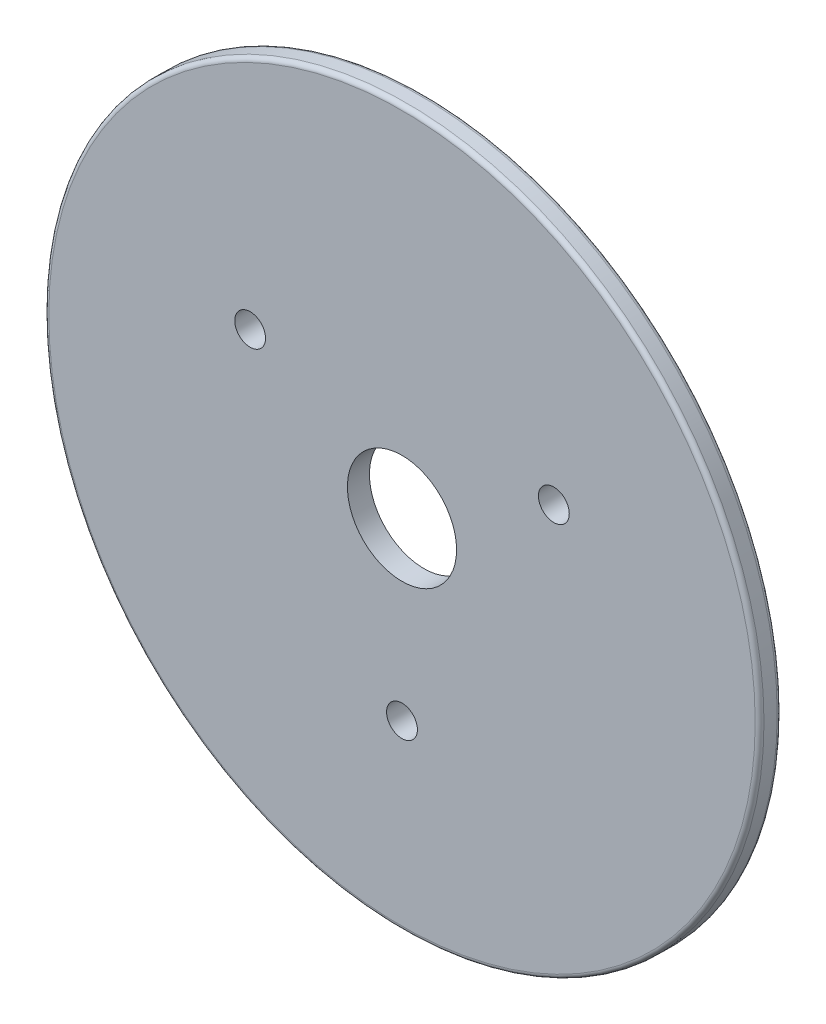
ISO-10303-21;
HEADER;
FILE_DESCRIPTION(('STEP AP214'),'2;1');
FILE_NAME('part.step','',(''),(''),'','','');
FILE_SCHEMA(('AUTOMOTIVE_DESIGN { 1 0 10303 214 1 1 1 1 }'));
ENDSEC;
DATA;
#1=APPLICATION_CONTEXT('core data for automotive mechanical design processes');
#2=APPLICATION_PROTOCOL_DEFINITION('international standard','automotive_design',2000,#1);
#3=PRODUCT_CONTEXT('',#1,'mechanical');
#4=PRODUCT('Part','Part','',(#3));
#5=PRODUCT_RELATED_PRODUCT_CATEGORY('part','',(#4));
#6=PRODUCT_DEFINITION_FORMATION('','',#4);
#7=PRODUCT_DEFINITION_CONTEXT('part definition',#1,'design');
#8=PRODUCT_DEFINITION('design','',#6,#7);
#9=PRODUCT_DEFINITION_SHAPE('','',#8);
#10=(LENGTH_UNIT() NAMED_UNIT(*) SI_UNIT(.MILLI.,.METRE.));
#11=(NAMED_UNIT(*) PLANE_ANGLE_UNIT() SI_UNIT($,.RADIAN.));
#12=(NAMED_UNIT(*) SI_UNIT($,.STERADIAN.) SOLID_ANGLE_UNIT());
#13=UNCERTAINTY_MEASURE_WITH_UNIT(LENGTH_MEASURE(1.E-05),#10,'distance_accuracy_value','');
#14=(GEOMETRIC_REPRESENTATION_CONTEXT(3) GLOBAL_UNCERTAINTY_ASSIGNED_CONTEXT((#13)) GLOBAL_UNIT_ASSIGNED_CONTEXT((#10,
#11,#12)) REPRESENTATION_CONTEXT('',''));
#15=CARTESIAN_POINT('',(0.,0.,0.));
#16=DIRECTION('',(0.,0.,1.));
#17=DIRECTION('',(1.,0.,0.));
#18=AXIS2_PLACEMENT_3D('',#15,#16,#17);
#19=CARTESIAN_POINT('',(17.2494961887,9.9590012679314,-17.25));
#20=DIRECTION('',(0.,0.,1.));
#21=DIRECTION('',(1.,0.,0.));
#22=AXIS2_PLACEMENT_3D('',#19,#20,#21);
#23=CYLINDRICAL_SURFACE('',#22,1.75);
#24=CARTESIAN_POINT('',(17.2494961887,9.9590012679314,-17.25));
#25=DIRECTION('',(0.,0.,1.));
#26=DIRECTION('',(1.,0.,0.));
#27=AXIS2_PLACEMENT_3D('',#24,#25,#26);
#28=CIRCLE('',#27,1.75);
#29=CARTESIAN_POINT('',(18.9994961887,9.9590012679314,-17.25));
#30=VERTEX_POINT('',#29);
#31=EDGE_CURVE('E57',#30,#30,#28,.T.);
#32=ORIENTED_EDGE('',*,*,#31,.F.);
#33=EDGE_LOOP('',(#32));
#34=FACE_BOUND('',#33,.T.);
#35=CARTESIAN_POINT('',(17.2494961887,9.9590012679314,-14.75));
#36=DIRECTION('',(0.,0.,1.));
#37=DIRECTION('',(1.,0.,0.));
#38=AXIS2_PLACEMENT_3D('',#35,#36,#37);
#39=CIRCLE('',#38,1.75);
#40=CARTESIAN_POINT('',(18.9994961887,9.9590012679314,-14.75));
#41=VERTEX_POINT('',#40);
#42=EDGE_CURVE('E61',#41,#41,#39,.F.);
#43=ORIENTED_EDGE('',*,*,#42,.F.);
#44=EDGE_LOOP('',(#43));
#45=FACE_BOUND('',#44,.T.);
#46=ADVANCED_FACE('F33',(#34,#45),#23,.F.);
#47=CARTESIAN_POINT('',(-17.2494961887,9.95900126793137,-17.25));
#48=DIRECTION('',(0.,0.,1.));
#49=DIRECTION('',(1.,0.,0.));
#50=AXIS2_PLACEMENT_3D('',#47,#48,#49);
#51=CYLINDRICAL_SURFACE('',#50,1.75);
#52=CARTESIAN_POINT('',(-17.2494961887,9.95900126793137,-17.25));
#53=DIRECTION('',(0.,0.,1.));
#54=DIRECTION('',(1.,0.,0.));
#55=AXIS2_PLACEMENT_3D('',#52,#53,#54);
#56=CIRCLE('',#55,1.75);
#57=CARTESIAN_POINT('',(-15.4994961887,9.95900126793137,-17.25));
#58=VERTEX_POINT('',#57);
#59=EDGE_CURVE('E60',#58,#58,#56,.T.);
#60=ORIENTED_EDGE('',*,*,#59,.F.);
#61=EDGE_LOOP('',(#60));
#62=FACE_BOUND('',#61,.T.);
#63=CARTESIAN_POINT('',(-17.2494961887,9.95900126793137,-14.75));
#64=DIRECTION('',(0.,0.,1.));
#65=DIRECTION('',(1.,0.,0.));
#66=AXIS2_PLACEMENT_3D('',#63,#64,#65);
#67=CIRCLE('',#66,1.75);
#68=CARTESIAN_POINT('',(-15.4994961887,9.95900126793137,-14.75));
#69=VERTEX_POINT('',#68);
#70=EDGE_CURVE('E68',#69,#69,#67,.F.);
#71=ORIENTED_EDGE('',*,*,#70,.F.);
#72=EDGE_LOOP('',(#71));
#73=FACE_BOUND('',#72,.T.);
#74=ADVANCED_FACE('F94',(#62,#73),#51,.F.);
#75=CARTESIAN_POINT('',(0.,-19.9180025358628,-17.25));
#76=DIRECTION('',(0.,0.,1.));
#77=DIRECTION('',(1.,0.,0.));
#78=AXIS2_PLACEMENT_3D('',#75,#76,#77);
#79=CYLINDRICAL_SURFACE('',#78,1.75);
#80=CARTESIAN_POINT('',(0.,-19.9180025358628,-17.25));
#81=DIRECTION('',(0.,0.,1.));
#82=DIRECTION('',(1.,0.,0.));
#83=AXIS2_PLACEMENT_3D('',#80,#81,#82);
#84=CIRCLE('',#83,1.75);
#85=CARTESIAN_POINT('',(1.75,-19.9180025358628,-17.25));
#86=VERTEX_POINT('',#85);
#87=EDGE_CURVE('E56',#86,#86,#84,.T.);
#88=ORIENTED_EDGE('',*,*,#87,.F.);
#89=EDGE_LOOP('',(#88));
#90=FACE_BOUND('',#89,.T.);
#91=CARTESIAN_POINT('',(0.,-19.9180025358628,-14.75));
#92=DIRECTION('',(0.,0.,1.));
#93=DIRECTION('',(1.,0.,0.));
#94=AXIS2_PLACEMENT_3D('',#91,#92,#93);
#95=CIRCLE('',#94,1.75);
#96=CARTESIAN_POINT('',(1.75,-19.9180025358628,-14.75));
#97=VERTEX_POINT('',#96);
#98=EDGE_CURVE('E71',#97,#97,#95,.F.);
#99=ORIENTED_EDGE('',*,*,#98,.F.);
#100=EDGE_LOOP('',(#99));
#101=FACE_BOUND('',#100,.T.);
#102=ADVANCED_FACE('F84',(#90,#101),#79,.F.);
#103=CARTESIAN_POINT('',(0.,0.,-7.25));
#104=DIRECTION('',(0.,0.,1.));
#105=DIRECTION('',(1.,0.,0.));
#106=AXIS2_PLACEMENT_3D('',#103,#104,#105);
#107=CYLINDRICAL_SURFACE('',#106,6.2);
#108=CARTESIAN_POINT('',(0.,0.,-17.25));
#109=DIRECTION('',(0.,0.,1.));
#110=DIRECTION('',(1.,0.,0.));
#111=AXIS2_PLACEMENT_3D('',#108,#109,#110);
#112=CIRCLE('',#111,6.2);
#113=CARTESIAN_POINT('',(6.2,0.,-17.25));
#114=VERTEX_POINT('',#113);
#115=EDGE_CURVE('E53',#114,#114,#112,.F.);
#116=CARTESIAN_POINT('',(0.,0.,-14.75));
#117=DIRECTION('',(0.,0.,1.));
#118=DIRECTION('',(1.,0.,0.));
#119=AXIS2_PLACEMENT_3D('',#116,#117,#118);
#120=CIRCLE('',#119,6.2);
#121=CARTESIAN_POINT('',(6.2,0.,-14.75));
#122=VERTEX_POINT('',#121);
#123=EDGE_CURVE('E74',#122,#122,#120,.F.);
#124=CARTESIAN_POINT('',(6.2,0.,-17.25));
#125=CARTESIAN_POINT('',(6.2,0.,-17.2239583333333));
#126=CARTESIAN_POINT('',(6.2,0.,-17.1979166666667));
#127=CARTESIAN_POINT('',(6.2,0.,-17.1458333333333));
#128=CARTESIAN_POINT('',(6.2,0.,-17.1197916666667));
#129=CARTESIAN_POINT('',(6.2,0.,-17.0677083333333));
#130=CARTESIAN_POINT('',(6.2,0.,-17.0416666666667));
#131=CARTESIAN_POINT('',(6.2,0.,-16.9895833333333));
#132=CARTESIAN_POINT('',(6.2,0.,-16.9635416666667));
#133=CARTESIAN_POINT('',(6.2,0.,-16.9114583333333));
#134=CARTESIAN_POINT('',(6.2,0.,-16.8854166666667));
#135=CARTESIAN_POINT('',(6.2,0.,-16.8333333333333));
#136=CARTESIAN_POINT('',(6.2,0.,-16.8072916666667));
#137=CARTESIAN_POINT('',(6.2,0.,-16.7552083333333));
#138=CARTESIAN_POINT('',(6.2,0.,-16.7291666666667));
#139=CARTESIAN_POINT('',(6.2,0.,-16.6770833333333));
#140=CARTESIAN_POINT('',(6.2,0.,-16.6510416666667));
#141=CARTESIAN_POINT('',(6.2,0.,-16.5989583333333));
#142=CARTESIAN_POINT('',(6.2,0.,-16.5729166666667));
#143=CARTESIAN_POINT('',(6.2,0.,-16.5208333333333));
#144=CARTESIAN_POINT('',(6.2,0.,-16.4947916666667));
#145=CARTESIAN_POINT('',(6.2,0.,-16.4427083333333));
#146=CARTESIAN_POINT('',(6.2,0.,-16.4166666666667));
#147=CARTESIAN_POINT('',(6.2,0.,-16.3645833333333));
#148=CARTESIAN_POINT('',(6.2,0.,-16.3385416666667));
#149=CARTESIAN_POINT('',(6.2,0.,-16.2864583333333));
#150=CARTESIAN_POINT('',(6.2,0.,-16.2604166666667));
#151=CARTESIAN_POINT('',(6.2,0.,-16.2083333333333));
#152=CARTESIAN_POINT('',(6.2,0.,-16.1822916666667));
#153=CARTESIAN_POINT('',(6.2,0.,-16.1302083333333));
#154=CARTESIAN_POINT('',(6.2,0.,-16.1041666666667));
#155=CARTESIAN_POINT('',(6.2,0.,-16.0520833333333));
#156=CARTESIAN_POINT('',(6.2,0.,-16.0260416666667));
#157=CARTESIAN_POINT('',(6.2,0.,-15.9739583333333));
#158=CARTESIAN_POINT('',(6.2,0.,-15.9479166666667));
#159=CARTESIAN_POINT('',(6.2,0.,-15.8958333333333));
#160=CARTESIAN_POINT('',(6.2,0.,-15.8697916666667));
#161=CARTESIAN_POINT('',(6.2,0.,-15.8177083333333));
#162=CARTESIAN_POINT('',(6.2,0.,-15.7916666666667));
#163=CARTESIAN_POINT('',(6.2,0.,-15.7395833333333));
#164=CARTESIAN_POINT('',(6.2,0.,-15.7135416666667));
#165=CARTESIAN_POINT('',(6.2,0.,-15.6614583333333));
#166=CARTESIAN_POINT('',(6.2,0.,-15.6354166666667));
#167=CARTESIAN_POINT('',(6.2,0.,-15.5833333333333));
#168=CARTESIAN_POINT('',(6.2,0.,-15.5572916666667));
#169=CARTESIAN_POINT('',(6.2,0.,-15.5052083333333));
#170=CARTESIAN_POINT('',(6.2,0.,-15.4791666666667));
#171=CARTESIAN_POINT('',(6.2,0.,-15.4270833333333));
#172=CARTESIAN_POINT('',(6.2,0.,-15.4010416666667));
#173=CARTESIAN_POINT('',(6.2,0.,-15.3489583333333));
#174=CARTESIAN_POINT('',(6.2,0.,-15.3229166666667));
#175=CARTESIAN_POINT('',(6.2,0.,-15.2708333333333));
#176=CARTESIAN_POINT('',(6.2,0.,-15.2447916666667));
#177=CARTESIAN_POINT('',(6.2,0.,-15.1927083333333));
#178=CARTESIAN_POINT('',(6.2,0.,-15.1666666666667));
#179=CARTESIAN_POINT('',(6.2,0.,-15.1145833333333));
#180=CARTESIAN_POINT('',(6.2,0.,-15.0885416666667));
#181=CARTESIAN_POINT('',(6.2,0.,-15.0364583333333));
#182=CARTESIAN_POINT('',(6.2,0.,-15.0104166666667));
#183=CARTESIAN_POINT('',(6.2,0.,-14.9583333333333));
#184=CARTESIAN_POINT('',(6.2,0.,-14.9322916666667));
#185=CARTESIAN_POINT('',(6.2,0.,-14.8802083333333));
#186=CARTESIAN_POINT('',(6.2,0.,-14.8541666666667));
#187=CARTESIAN_POINT('',(6.2,0.,-14.8020833333333));
#188=CARTESIAN_POINT('',(6.2,0.,-14.7760416666667));
#189=CARTESIAN_POINT('',(6.2,0.,-14.75));
#190=B_SPLINE_CURVE_WITH_KNOTS('',3,(#124,#125,#126,#127,#128,#129,#130,#131,#132,#133,#134,
#135,#136,#137,#138,#139,#140,#141,#142,#143,#144,#145,#146,#147,#148,#149,#150,#151,#152,#153,
#154,#155,#156,#157,#158,#159,#160,#161,#162,#163,#164,#165,#166,#167,#168,#169,#170,#171,#172,
#173,#174,#175,#176,#177,#178,#179,#180,#181,#182,#183,#184,#185,#186,#187,#188,#189),
.UNSPECIFIED.,.F.,.F.,(4,2,2,2,2,2,2,2,2,2,2,2,2,2,2,2,2,2,2,2,2,2,2,2,2,2,2,2,2,2,2,2,4),(0.,
0.0781250000000018,0.15625,0.234375000000002,0.3125,0.390625000000002,0.46875,0.546875000000002,
0.625000000000001,0.703125000000002,0.781250000000001,0.859375000000002,0.937500000000001,
1.015625,1.09375,1.171875,1.25,1.328125,1.40625,1.484375,1.5625,1.640625,1.71875,1.796875,1.875,
1.953125,2.03125,2.109375,2.1875,2.265625,2.34375,2.421875,2.5),.UNSPECIFIED.);
#191=EDGE_CURVE('BSEAM81',#114,#122,#190,.T.);
#192=ORIENTED_EDGE('',*,*,#115,.T.);
#193=ORIENTED_EDGE('',*,*,#123,.F.);
#194=ORIENTED_EDGE('',*,*,#191,.T.);
#195=ORIENTED_EDGE('',*,*,#191,.F.);
#196=EDGE_LOOP('',(#192,#194,#193,#195));
#197=FACE_BOUND('',#196,.T.);
#198=ADVANCED_FACE('F81',(#197),#107,.F.);
#199=CARTESIAN_POINT('',(0.,0.,-17.25));
#200=DIRECTION('',(0.,0.,1.));
#201=DIRECTION('',(1.,0.,0.));
#202=AXIS2_PLACEMENT_3D('',#199,#200,#201);
#203=CYLINDRICAL_SURFACE('',#202,40.6219609448882);
#204=CARTESIAN_POINT('',(0.,0.,-15.25));
#205=DIRECTION('',(0.,0.,-1.));
#206=DIRECTION('',(-1.,0.,0.));
#207=AXIS2_PLACEMENT_3D('',#204,#205,#206);
#208=CIRCLE('',#207,40.6219609448882);
#209=CARTESIAN_POINT('',(-40.6219609448882,0.,-15.25));
#210=VERTEX_POINT('',#209);
#211=EDGE_CURVE('E44',#210,#210,#208,.T.);
#212=ORIENTED_EDGE('',*,*,#211,.T.);
#213=EDGE_LOOP('',(#212));
#214=FACE_BOUND('',#213,.T.);
#215=CARTESIAN_POINT('',(0.,0.,-16.75));
#216=DIRECTION('',(0.,0.,-1.));
#217=DIRECTION('',(-1.,0.,0.));
#218=AXIS2_PLACEMENT_3D('',#215,#216,#217);
#219=CIRCLE('',#218,40.6219609448882);
#220=CARTESIAN_POINT('',(-40.6219609448882,0.,-16.75));
#221=VERTEX_POINT('',#220);
#222=EDGE_CURVE('E48',#221,#221,#219,.F.);
#223=ORIENTED_EDGE('',*,*,#222,.T.);
#224=EDGE_LOOP('',(#223));
#225=FACE_BOUND('',#224,.T.);
#226=ADVANCED_FACE('F83',(#214,#225),#203,.T.);
#227=CARTESIAN_POINT('',(0.,0.,-17.25));
#228=DIRECTION('',(0.,0.,-1.));
#229=DIRECTION('',(-1.,0.,0.));
#230=AXIS2_PLACEMENT_3D('',#227,#228,#229);
#231=PLANE('',#230);
#232=ORIENTED_EDGE('',*,*,#87,.T.);
#233=EDGE_LOOP('',(#232));
#234=FACE_BOUND('',#233,.T.);
#235=ORIENTED_EDGE('',*,*,#59,.T.);
#236=EDGE_LOOP('',(#235));
#237=FACE_BOUND('',#236,.T.);
#238=ORIENTED_EDGE('',*,*,#31,.T.);
#239=EDGE_LOOP('',(#238));
#240=FACE_BOUND('',#239,.T.);
#241=ORIENTED_EDGE('',*,*,#115,.F.);
#242=EDGE_LOOP('',(#241));
#243=FACE_BOUND('',#242,.T.);
#244=CARTESIAN_POINT('',(0.,0.,-17.25));
#245=DIRECTION('',(0.,0.,-1.));
#246=DIRECTION('',(-1.,0.,0.));
#247=AXIS2_PLACEMENT_3D('',#244,#245,#246);
#248=CIRCLE('',#247,40.1219609448882);
#249=CARTESIAN_POINT('',(-40.1219609448882,0.,-17.25));
#250=VERTEX_POINT('',#249);
#251=EDGE_CURVE('E10',#250,#250,#248,.T.);
#252=ORIENTED_EDGE('',*,*,#251,.T.);
#253=EDGE_LOOP('',(#252));
#254=FACE_BOUND('',#253,.T.);
#255=ADVANCED_FACE('F91',(#234,#237,#240,#243,#254),#231,.T.);
#256=CARTESIAN_POINT('',(0.,0.,-14.75));
#257=DIRECTION('',(0.,0.,-1.));
#258=DIRECTION('',(-1.,0.,0.));
#259=AXIS2_PLACEMENT_3D('',#256,#257,#258);
#260=PLANE('',#259);
#261=CARTESIAN_POINT('',(0.,0.,-14.75));
#262=DIRECTION('',(0.,0.,-1.));
#263=DIRECTION('',(-1.,0.,0.));
#264=AXIS2_PLACEMENT_3D('',#261,#262,#263);
#265=CIRCLE('',#264,40.1219609448882);
#266=CARTESIAN_POINT('',(-40.1219609448882,0.,-14.75));
#267=VERTEX_POINT('',#266);
#268=EDGE_CURVE('E40',#267,#267,#265,.F.);
#269=ORIENTED_EDGE('',*,*,#268,.T.);
#270=EDGE_LOOP('',(#269));
#271=FACE_BOUND('',#270,.T.);
#272=ORIENTED_EDGE('',*,*,#123,.T.);
#273=EDGE_LOOP('',(#272));
#274=FACE_BOUND('',#273,.T.);
#275=ORIENTED_EDGE('',*,*,#98,.T.);
#276=EDGE_LOOP('',(#275));
#277=FACE_BOUND('',#276,.T.);
#278=ORIENTED_EDGE('',*,*,#70,.T.);
#279=EDGE_LOOP('',(#278));
#280=FACE_BOUND('',#279,.T.);
#281=ORIENTED_EDGE('',*,*,#42,.T.);
#282=EDGE_LOOP('',(#281));
#283=FACE_BOUND('',#282,.T.);
#284=ADVANCED_FACE('F78',(#271,#274,#277,#280,#283),#260,.F.);
#285=CARTESIAN_POINT('',(0.,0.,-15.25));
#286=DIRECTION('',(0.,0.,-1.));
#287=DIRECTION('',(-1.,0.,0.));
#288=AXIS2_PLACEMENT_3D('',#285,#286,#287);
#289=TOROIDAL_SURFACE('',#288,40.1219609448882,0.5);
#290=ORIENTED_EDGE('',*,*,#268,.F.);
#291=EDGE_LOOP('',(#290));
#292=FACE_BOUND('',#291,.T.);
#293=ORIENTED_EDGE('',*,*,#211,.F.);
#294=EDGE_LOOP('',(#293));
#295=FACE_BOUND('',#294,.T.);
#296=ADVANCED_FACE('F112',(#292,#295),#289,.T.);
#297=CARTESIAN_POINT('',(0.,0.,-16.75));
#298=DIRECTION('',(0.,0.,-1.));
#299=DIRECTION('',(-1.,0.,0.));
#300=AXIS2_PLACEMENT_3D('',#297,#298,#299);
#301=TOROIDAL_SURFACE('',#300,40.1219609448882,0.5);
#302=ORIENTED_EDGE('',*,*,#222,.F.);
#303=EDGE_LOOP('',(#302));
#304=FACE_BOUND('',#303,.T.);
#305=ORIENTED_EDGE('',*,*,#251,.F.);
#306=EDGE_LOOP('',(#305));
#307=FACE_BOUND('',#306,.T.);
#308=ADVANCED_FACE('F35',(#304,#307),#301,.T.);
#309=CLOSED_SHELL('',(#46,#74,#102,#198,#226,#255,#284,#296,#308));
#310=MANIFOLD_SOLID_BREP('B2',#309);
#311=ADVANCED_BREP_SHAPE_REPRESENTATION('',(#18,#310),#14);
#312=SHAPE_DEFINITION_REPRESENTATION(#9,#311);
ENDSEC;
END-ISO-10303-21;
